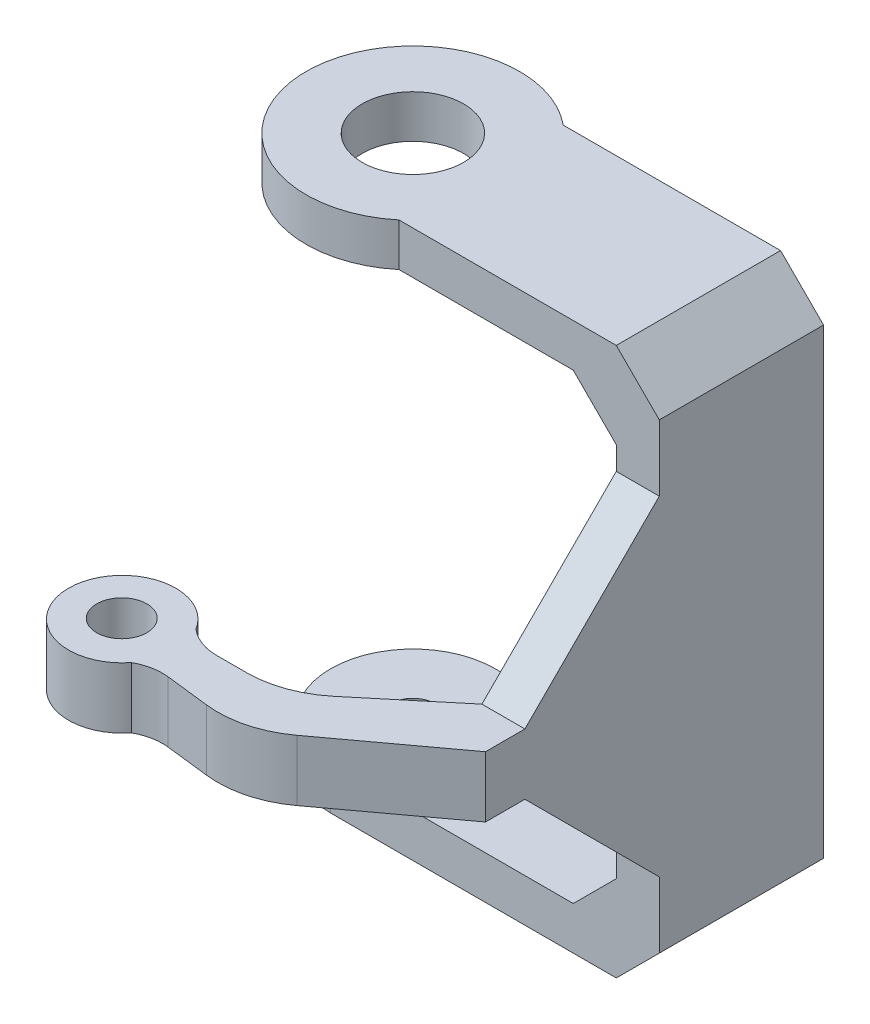
ISO-10303-21;
HEADER;
FILE_DESCRIPTION(('STEP AP214'),'2;1');
FILE_NAME('part.step','',(''),(''),'','','');
FILE_SCHEMA(('AUTOMOTIVE_DESIGN { 1 0 10303 214 1 1 1 1 }'));
ENDSEC;
DATA;
#1=APPLICATION_CONTEXT('core data for automotive mechanical design processes');
#2=APPLICATION_PROTOCOL_DEFINITION('international standard','automotive_design',2000,#1);
#3=PRODUCT_CONTEXT('',#1,'mechanical');
#4=PRODUCT('Part','Part','',(#3));
#5=PRODUCT_RELATED_PRODUCT_CATEGORY('part','',(#4));
#6=PRODUCT_DEFINITION_FORMATION('','',#4);
#7=PRODUCT_DEFINITION_CONTEXT('part definition',#1,'design');
#8=PRODUCT_DEFINITION('design','',#6,#7);
#9=PRODUCT_DEFINITION_SHAPE('','',#8);
#10=(LENGTH_UNIT() NAMED_UNIT(*) SI_UNIT(.MILLI.,.METRE.));
#11=(NAMED_UNIT(*) PLANE_ANGLE_UNIT() SI_UNIT($,.RADIAN.));
#12=(NAMED_UNIT(*) SI_UNIT($,.STERADIAN.) SOLID_ANGLE_UNIT());
#13=UNCERTAINTY_MEASURE_WITH_UNIT(LENGTH_MEASURE(1.E-05),#10,'distance_accuracy_value','');
#14=(GEOMETRIC_REPRESENTATION_CONTEXT(3) GLOBAL_UNCERTAINTY_ASSIGNED_CONTEXT((#13)) GLOBAL_UNIT_ASSIGNED_CONTEXT((#10,
#11,#12)) REPRESENTATION_CONTEXT('',''));
#15=CARTESIAN_POINT('',(0.,0.,0.));
#16=DIRECTION('',(0.,0.,1.));
#17=DIRECTION('',(1.,0.,0.));
#18=AXIS2_PLACEMENT_3D('',#15,#16,#17);
#19=CARTESIAN_POINT('',(0.,0.,5.73));
#20=DIRECTION('',(0.,0.,-1.));
#21=DIRECTION('',(-1.,0.,0.));
#22=AXIS2_PLACEMENT_3D('',#19,#20,#21);
#23=PLANE('',#22);
#24=DIRECTION('',(0.,-1.,0.));
#25=VECTOR('',#24,1.);
#26=CARTESIAN_POINT('',(35.166137814186,7.57800769576588,5.73));
#27=LINE('',#26,#25);
#28=CARTESIAN_POINT('',(35.166137814186,33.7980089760736,5.73));
#29=VERTEX_POINT('',#28);
#30=CARTESIAN_POINT('',(35.166137814186,32.188009467812,5.73));
#31=VERTEX_POINT('',#30);
#32=EDGE_CURVE('E465',#29,#31,#27,.T.);
#33=ORIENTED_EDGE('',*,*,#32,.T.);
#34=DIRECTION('',(1.,0.,0.));
#35=VECTOR('',#34,1.);
#36=CARTESIAN_POINT('',(35.166137814186,32.188009467812,5.73));
#37=LINE('',#36,#35);
#38=CARTESIAN_POINT('',(38.1661392372471,32.188009467812,5.73));
#39=VERTEX_POINT('',#38);
#40=EDGE_CURVE('E306',#31,#39,#37,.T.);
#41=ORIENTED_EDGE('',*,*,#40,.T.);
#42=DIRECTION('',(0.,1.,0.));
#43=VECTOR('',#42,1.);
#44=CARTESIAN_POINT('',(38.1661392372471,36.7980048111987,5.73));
#45=LINE('',#44,#43);
#46=CARTESIAN_POINT('',(38.1661392372471,36.7980048111987,5.73));
#47=VERTEX_POINT('',#46);
#48=EDGE_CURVE('E431',#39,#47,#45,.T.);
#49=ORIENTED_EDGE('',*,*,#48,.T.);
#50=DIRECTION('',(-0.707106561671647,0.70710700070138,0.));
#51=VECTOR('',#50,1.);
#52=CARTESIAN_POINT('',(35.1661387455087,39.7980071655833,5.73));
#53=LINE('',#52,#51);
#54=CARTESIAN_POINT('',(35.1658008859548,39.7976693062391,5.73));
#55=VERTEX_POINT('',#54);
#56=EDGE_CURVE('E422',#47,#55,#53,.T.);
#57=ORIENTED_EDGE('',*,*,#56,.T.);
#58=DIRECTION('',(-1.,0.,0.));
#59=VECTOR('',#58,1.);
#60=CARTESIAN_POINT('',(32.1661391850928,39.7973314468949,5.73));
#61=LINE('',#60,#59);
#62=CARTESIAN_POINT('',(20.0061391850928,39.7973314468949,5.73));
#63=VERTEX_POINT('',#62);
#64=EDGE_CURVE('E349',#55,#63,#61,.T.);
#65=ORIENTED_EDGE('',*,*,#64,.T.);
#66=DIRECTION('',(0.,-1.,0.));
#67=VECTOR('',#66,1.);
#68=CARTESIAN_POINT('',(20.0061391850928,39.7973314468949,5.73));
#69=LINE('',#68,#67);
#70=CARTESIAN_POINT('',(20.0061391850928,36.798009467812,5.73));
#71=VERTEX_POINT('',#70);
#72=EDGE_CURVE('E360',#63,#71,#69,.T.);
#73=ORIENTED_EDGE('',*,*,#72,.T.);
#74=DIRECTION('',(1.,0.,0.));
#75=VECTOR('',#74,1.);
#76=CARTESIAN_POINT('',(32.1661391850928,36.798009467812,5.73));
#77=LINE('',#76,#75);
#78=CARTESIAN_POINT('',(32.1661391850928,36.798009467812,5.73));
#79=VERTEX_POINT('',#78);
#80=EDGE_CURVE('E363',#71,#79,#77,.T.);
#81=ORIENTED_EDGE('',*,*,#80,.T.);
#82=DIRECTION('',(0.707106561671647,-0.70710700070138,0.));
#83=VECTOR('',#82,1.);
#84=CARTESIAN_POINT('',(35.166137814186,33.7980089760736,5.73));
#85=LINE('',#84,#83);
#86=EDGE_CURVE('E359',#79,#29,#85,.T.);
#87=ORIENTED_EDGE('',*,*,#86,.T.);
#88=EDGE_LOOP('',(#33,#41,#49,#57,#65,#73,#81,#87));
#89=FACE_BOUND('',#88,.T.);
#90=ADVANCED_FACE('F33',(#89),#23,.F.);
#91=CARTESIAN_POINT('',(35.166137814186,33.7980089760736,-5.73));
#92=DIRECTION('',(-0.70710700070138,-0.707106561671647,0.));
#93=DIRECTION('',(0.707106561671647,-0.70710700070138,0.));
#94=AXIS2_PLACEMENT_3D('',#91,#92,#93);
#95=PLANE('',#94);
#96=DIRECTION('',(0.,0.,1.));
#97=VECTOR('',#96,1.);
#98=CARTESIAN_POINT('',(35.166137814186,33.7980089760736,-5.73));
#99=LINE('',#98,#97);
#100=CARTESIAN_POINT('',(35.166137814186,33.7980089760736,-5.73));
#101=VERTEX_POINT('',#100);
#102=EDGE_CURVE('E419',#101,#29,#99,.T.);
#103=ORIENTED_EDGE('',*,*,#102,.T.);
#104=ORIENTED_EDGE('',*,*,#86,.F.);
#105=DIRECTION('',(0.,0.,1.));
#106=VECTOR('',#105,1.);
#107=CARTESIAN_POINT('',(32.1661391850928,36.798009467812,-5.73));
#108=LINE('',#107,#106);
#109=CARTESIAN_POINT('',(32.1661391850928,36.798009467812,-5.73));
#110=VERTEX_POINT('',#109);
#111=EDGE_CURVE('E11',#110,#79,#108,.T.);
#112=ORIENTED_EDGE('',*,*,#111,.F.);
#113=DIRECTION('',(0.707106561671647,-0.70710700070138,0.));
#114=VECTOR('',#113,1.);
#115=CARTESIAN_POINT('',(35.166137814186,33.7980089760736,-5.73));
#116=LINE('',#115,#114);
#117=EDGE_CURVE('E424',#110,#101,#116,.T.);
#118=ORIENTED_EDGE('',*,*,#117,.T.);
#119=EDGE_LOOP('',(#103,#104,#112,#118));
#120=FACE_BOUND('',#119,.T.);
#121=ADVANCED_FACE('F35',(#120),#95,.T.);
#122=CARTESIAN_POINT('',(35.1661387455087,39.7980071655833,-5.73));
#123=DIRECTION('',(0.70710700070138,0.707106561671647,0.));
#124=DIRECTION('',(-0.707106561671647,0.70710700070138,0.));
#125=AXIS2_PLACEMENT_3D('',#122,#123,#124);
#126=PLANE('',#125);
#127=CARTESIAN_POINT('',(35.1661387455087,39.7980071655833,-5.73));
#128=DIRECTION('',(0.,0.,1.));
#129=VECTOR('',#128,1.);
#130=LINE('',#127,#129);
#131=CARTESIAN_POINT('',(35.1658008859548,39.7976693062391,-5.73));
#132=VERTEX_POINT('',#131);
#133=EDGE_CURVE('E42',#132,#55,#130,.T.);
#134=ORIENTED_EDGE('',*,*,#133,.T.);
#135=ORIENTED_EDGE('',*,*,#56,.F.);
#136=DIRECTION('',(0.,0.,1.));
#137=VECTOR('',#136,1.);
#138=CARTESIAN_POINT('',(38.1661392372471,36.7980048111987,-5.73));
#139=LINE('',#138,#137);
#140=CARTESIAN_POINT('',(38.1661392372471,36.7980048111987,-5.73));
#141=VERTEX_POINT('',#140);
#142=EDGE_CURVE('E446',#141,#47,#139,.T.);
#143=ORIENTED_EDGE('',*,*,#142,.F.);
#144=DIRECTION('',(-0.707106561671647,0.70710700070138,0.));
#145=VECTOR('',#144,1.);
#146=CARTESIAN_POINT('',(35.1661387455087,39.7980071655833,-5.73));
#147=LINE('',#146,#145);
#148=EDGE_CURVE('E412',#141,#132,#147,.T.);
#149=ORIENTED_EDGE('',*,*,#148,.T.);
#150=EDGE_LOOP('',(#134,#135,#143,#149));
#151=FACE_BOUND('',#150,.T.);
#152=ADVANCED_FACE('F399',(#151),#126,.T.);
#153=CARTESIAN_POINT('',(38.1661392372471,36.7980048111987,-5.73));
#154=DIRECTION('',(1.,0.,0.));
#155=DIRECTION('',(0.,1.,0.));
#156=AXIS2_PLACEMENT_3D('',#153,#154,#155);
#157=PLANE('',#156);
#158=ORIENTED_EDGE('',*,*,#142,.T.);
#159=ORIENTED_EDGE('',*,*,#48,.F.);
#160=DIRECTION('',(0.,-0.707106781186546,0.707106781186549));
#161=VECTOR('',#160,1.);
#162=CARTESIAN_POINT('',(38.1661392372471,32.188009467812,5.73));
#163=LINE('',#162,#161);
#164=CARTESIAN_POINT('',(38.1661392372471,22.8117735492783,15.1062359185336));
#165=VERTEX_POINT('',#164);
#166=EDGE_CURVE('E276',#39,#165,#163,.T.);
#167=ORIENTED_EDGE('',*,*,#166,.T.);
#168=DIRECTION('',(0.,0.,1.));
#169=VECTOR('',#168,1.);
#170=CARTESIAN_POINT('',(38.1661392372471,22.8117747122887,15.1062359185336));
#171=LINE('',#170,#169);
#172=CARTESIAN_POINT('',(38.1661392372471,22.8117747122887,17.8562359185336));
#173=VERTEX_POINT('',#172);
#174=EDGE_CURVE('E243',#165,#173,#171,.T.);
#175=ORIENTED_EDGE('',*,*,#174,.T.);
#176=DIRECTION('',(0.,-1.,0.));
#177=VECTOR('',#176,1.);
#178=CARTESIAN_POINT('',(38.1661392372471,22.8117747122887,17.8562359185336));
#179=LINE('',#178,#177);
#180=CARTESIAN_POINT('',(38.1661392372471,18.5642447122887,17.8562359185336));
#181=VERTEX_POINT('',#180);
#182=EDGE_CURVE('E281',#173,#181,#179,.T.);
#183=ORIENTED_EDGE('',*,*,#182,.T.);
#184=DIRECTION('',(0.,0.,1.));
#185=VECTOR('',#184,1.);
#186=CARTESIAN_POINT('',(38.1661392372471,18.5642447122887,15.1062359185336));
#187=LINE('',#186,#185);
#188=CARTESIAN_POINT('',(38.1661392372471,18.5642447122887,15.1062359185336));
#189=VERTEX_POINT('',#188);
#190=EDGE_CURVE('E267',#189,#181,#187,.T.);
#191=ORIENTED_EDGE('',*,*,#190,.F.);
#192=DIRECTION('',(0.,-0.707106781186551,-0.707106781186544));
#193=VECTOR('',#192,1.);
#194=CARTESIAN_POINT('',(38.1661392372471,9.18800627270455,5.73));
#195=LINE('',#194,#193);
#196=CARTESIAN_POINT('',(38.1661392372471,9.18800627270455,5.73));
#197=VERTEX_POINT('',#196);
#198=EDGE_CURVE('E295',#189,#197,#195,.T.);
#199=ORIENTED_EDGE('',*,*,#198,.T.);
#200=CARTESIAN_POINT('',(38.1661392372471,4.57800627270455,5.73));
#201=VERTEX_POINT('',#200);
#202=EDGE_CURVE('E50',#201,#197,#45,.T.);
#203=ORIENTED_EDGE('',*,*,#202,.F.);
#204=DIRECTION('',(0.,0.,1.));
#205=VECTOR('',#204,1.);
#206=CARTESIAN_POINT('',(38.1661392372471,4.57800627270455,-5.73));
#207=LINE('',#206,#205);
#208=CARTESIAN_POINT('',(38.1661392372471,4.57800627270455,-5.73));
#209=VERTEX_POINT('',#208);
#210=EDGE_CURVE('E449',#209,#201,#207,.T.);
#211=ORIENTED_EDGE('',*,*,#210,.F.);
#212=DIRECTION('',(0.,1.,0.));
#213=VECTOR('',#212,1.);
#214=CARTESIAN_POINT('',(38.1661392372471,36.7980048111987,-5.73));
#215=LINE('',#214,#213);
#216=EDGE_CURVE('E420',#209,#141,#215,.T.);
#217=ORIENTED_EDGE('',*,*,#216,.T.);
#218=EDGE_LOOP('',(#158,#159,#167,#175,#183,#191,#199,#203,#211,#217));
#219=FACE_BOUND('',#218,.T.);
#220=ADVANCED_FACE('F403',(#219),#157,.T.);
#221=CARTESIAN_POINT('',(38.1661392372471,4.57800627270455,-5.73));
#222=DIRECTION('',(0.707106561671647,-0.70710700070138,0.));
#223=DIRECTION('',(0.70710700070138,0.707106561671647,0.));
#224=AXIS2_PLACEMENT_3D('',#221,#222,#223);
#225=PLANE('',#224);
#226=ORIENTED_EDGE('',*,*,#210,.T.);
#227=DIRECTION('',(0.70710700070138,0.707106561671647,0.));
#228=VECTOR('',#227,1.);
#229=CARTESIAN_POINT('',(38.1661392372471,4.57800627270455,5.73));
#230=LINE('',#229,#228);
#231=CARTESIAN_POINT('',(35.1661378141855,1.57800671228865,5.73));
#232=VERTEX_POINT('',#231);
#233=EDGE_CURVE('E433',#232,#201,#230,.T.);
#234=ORIENTED_EDGE('',*,*,#233,.F.);
#235=DIRECTION('',(0.,0.,1.));
#236=VECTOR('',#235,1.);
#237=CARTESIAN_POINT('',(35.1661378141855,1.57800671228865,-5.73));
#238=LINE('',#237,#236);
#239=CARTESIAN_POINT('',(35.1661378141855,1.57800671228865,-5.73));
#240=VERTEX_POINT('',#239);
#241=EDGE_CURVE('E451',#240,#232,#238,.T.);
#242=ORIENTED_EDGE('',*,*,#241,.F.);
#243=DIRECTION('',(0.70710700070138,0.707106561671647,0.));
#244=VECTOR('',#243,1.);
#245=CARTESIAN_POINT('',(38.1661392372471,4.57800627270455,-5.73));
#246=LINE('',#245,#244);
#247=EDGE_CURVE('E441',#240,#209,#246,.T.);
#248=ORIENTED_EDGE('',*,*,#247,.T.);
#249=EDGE_LOOP('',(#226,#234,#242,#248));
#250=FACE_BOUND('',#249,.T.);
#251=ADVANCED_FACE('F530',(#250),#225,.T.);
#252=CARTESIAN_POINT('',(32.1661373224477,4.5780090666727,-5.73));
#253=DIRECTION('',(-0.707106561671646,0.707107000701381,0.));
#254=DIRECTION('',(-0.707107000701381,-0.707106561671646,0.));
#255=AXIS2_PLACEMENT_3D('',#252,#253,#254);
#256=PLANE('',#255);
#257=DIRECTION('',(0.,0.,1.));
#258=VECTOR('',#257,1.);
#259=CARTESIAN_POINT('',(32.1661373224477,4.5780090666727,-5.73));
#260=LINE('',#259,#258);
#261=CARTESIAN_POINT('',(32.1661373224477,4.5780090666727,-5.73));
#262=VERTEX_POINT('',#261);
#263=CARTESIAN_POINT('',(32.1661373224477,4.5780090666727,5.73));
#264=VERTEX_POINT('',#263);
#265=EDGE_CURVE('E454',#262,#264,#260,.T.);
#266=ORIENTED_EDGE('',*,*,#265,.T.);
#267=DIRECTION('',(-0.707107000701381,-0.707106561671646,0.));
#268=VECTOR('',#267,1.);
#269=CARTESIAN_POINT('',(32.1661373224477,4.5780090666727,5.73));
#270=LINE('',#269,#268);
#271=CARTESIAN_POINT('',(35.166137814186,7.57800769576588,5.73));
#272=VERTEX_POINT('',#271);
#273=EDGE_CURVE('E467',#272,#264,#270,.T.);
#274=ORIENTED_EDGE('',*,*,#273,.F.);
#275=DIRECTION('',(0.,0.,1.));
#276=VECTOR('',#275,1.);
#277=CARTESIAN_POINT('',(35.166137814186,7.57800769576588,-5.73));
#278=LINE('',#277,#276);
#279=CARTESIAN_POINT('',(35.166137814186,7.57800769576588,-5.73));
#280=VERTEX_POINT('',#279);
#281=EDGE_CURVE('E456',#280,#272,#278,.T.);
#282=ORIENTED_EDGE('',*,*,#281,.F.);
#283=DIRECTION('',(-0.707107000701381,-0.707106561671646,0.));
#284=VECTOR('',#283,1.);
#285=CARTESIAN_POINT('',(32.1661373224477,4.5780090666727,-5.73));
#286=LINE('',#285,#284);
#287=EDGE_CURVE('E439',#280,#262,#286,.T.);
#288=ORIENTED_EDGE('',*,*,#287,.T.);
#289=EDGE_LOOP('',(#266,#274,#282,#288));
#290=FACE_BOUND('',#289,.T.);
#291=ADVANCED_FACE('F519',(#290),#256,.T.);
#292=CARTESIAN_POINT('',(35.166137814186,7.57800769576588,-5.73));
#293=DIRECTION('',(-1.,0.,0.));
#294=DIRECTION('',(0.,0.,1.));
#295=AXIS2_PLACEMENT_3D('',#292,#293,#294);
#296=PLANE('',#295);
#297=ORIENTED_EDGE('',*,*,#281,.T.);
#298=CARTESIAN_POINT('',(35.166137814186,9.18800627270455,5.73));
#299=VERTEX_POINT('',#298);
#300=EDGE_CURVE('E468',#299,#272,#27,.T.);
#301=ORIENTED_EDGE('',*,*,#300,.F.);
#302=DIRECTION('',(0.,-0.707106781186551,-0.707106781186544));
#303=VECTOR('',#302,1.);
#304=CARTESIAN_POINT('',(35.166137814186,9.18800627270455,5.73));
#305=LINE('',#304,#303);
#306=CARTESIAN_POINT('',(35.166137814186,18.5642421912382,15.1062359185336));
#307=VERTEX_POINT('',#306);
#308=EDGE_CURVE('E298',#307,#299,#305,.T.);
#309=ORIENTED_EDGE('',*,*,#308,.F.);
#310=DIRECTION('',(0.,-1.,0.));
#311=VECTOR('',#310,1.);
#312=CARTESIAN_POINT('',(35.166137814186,22.8117735492783,15.1062359185336));
#313=LINE('',#312,#311);
#314=CARTESIAN_POINT('',(35.166137814186,22.8117735492783,15.1062359185336));
#315=VERTEX_POINT('',#314);
#316=EDGE_CURVE('E294',#315,#307,#313,.T.);
#317=ORIENTED_EDGE('',*,*,#316,.F.);
#318=DIRECTION('',(0.,-0.707106781186546,0.707106781186549));
#319=VECTOR('',#318,1.);
#320=CARTESIAN_POINT('',(35.166137814186,32.188009467812,5.73));
#321=LINE('',#320,#319);
#322=EDGE_CURVE('E291',#31,#315,#321,.T.);
#323=ORIENTED_EDGE('',*,*,#322,.F.);
#324=ORIENTED_EDGE('',*,*,#32,.F.);
#325=ORIENTED_EDGE('',*,*,#102,.F.);
#326=DIRECTION('',(0.,-1.,0.));
#327=VECTOR('',#326,1.);
#328=CARTESIAN_POINT('',(35.166137814186,7.57800769576588,-5.73));
#329=LINE('',#328,#327);
#330=EDGE_CURVE('E429',#101,#280,#329,.T.);
#331=ORIENTED_EDGE('',*,*,#330,.T.);
#332=EDGE_LOOP('',(#297,#301,#309,#317,#323,#324,#325,#331));
#333=FACE_BOUND('',#332,.T.);
#334=ADVANCED_FACE('F397',(#333),#296,.T.);
#335=CARTESIAN_POINT('',(0.,0.,-5.73));
#336=DIRECTION('',(0.,0.,-1.));
#337=DIRECTION('',(-1.,0.,0.));
#338=AXIS2_PLACEMENT_3D('',#335,#336,#337);
#339=PLANE('',#338);
#340=ORIENTED_EDGE('',*,*,#117,.F.);
#341=DIRECTION('',(1.,0.,0.));
#342=VECTOR('',#341,1.);
#343=CARTESIAN_POINT('',(32.1661391850928,36.798009467812,-5.73));
#344=LINE('',#343,#342);
#345=CARTESIAN_POINT('',(20.0061391850928,36.798009467812,-5.73));
#346=VERTEX_POINT('',#345);
#347=EDGE_CURVE('E355',#346,#110,#344,.T.);
#348=ORIENTED_EDGE('',*,*,#347,.F.);
#349=DIRECTION('',(0.,-1.,0.));
#350=VECTOR('',#349,1.);
#351=CARTESIAN_POINT('',(20.0061391850928,39.7973314468949,-5.73));
#352=LINE('',#351,#350);
#353=CARTESIAN_POINT('',(20.0061391850928,39.7973314468949,-5.73));
#354=VERTEX_POINT('',#353);
#355=EDGE_CURVE('E353',#354,#346,#352,.T.);
#356=ORIENTED_EDGE('',*,*,#355,.F.);
#357=DIRECTION('',(-1.,0.,0.));
#358=VECTOR('',#357,1.);
#359=CARTESIAN_POINT('',(32.1661391850928,39.7973314468949,-5.73));
#360=LINE('',#359,#358);
#361=EDGE_CURVE('E356',#132,#354,#360,.T.);
#362=ORIENTED_EDGE('',*,*,#361,.F.);
#363=ORIENTED_EDGE('',*,*,#148,.F.);
#364=ORIENTED_EDGE('',*,*,#216,.F.);
#365=ORIENTED_EDGE('',*,*,#247,.F.);
#366=DIRECTION('',(1.,0.,0.));
#367=VECTOR('',#366,1.);
#368=CARTESIAN_POINT('',(20.0061373224477,1.57800671228865,-5.73));
#369=LINE('',#368,#367);
#370=CARTESIAN_POINT('',(15.2448788477451,1.57800671228865,-5.73));
#371=VERTEX_POINT('',#370);
#372=EDGE_CURVE('E345',#371,#240,#369,.T.);
#373=ORIENTED_EDGE('',*,*,#372,.F.);
#374=DIRECTION('',(0.,-1.,0.));
#375=VECTOR('',#374,1.);
#376=CARTESIAN_POINT('',(15.2448788477451,4.57800671228865,-5.73));
#377=LINE('',#376,#375);
#378=CARTESIAN_POINT('',(15.2448788477451,4.57800671228865,-5.73));
#379=VERTEX_POINT('',#378);
#380=EDGE_CURVE('E327',#379,#371,#377,.T.);
#381=ORIENTED_EDGE('',*,*,#380,.F.);
#382=DIRECTION('',(-1.,0.,0.));
#383=VECTOR('',#382,1.);
#384=CARTESIAN_POINT('',(32.1661373224477,4.5780090666727,-5.73));
#385=LINE('',#384,#383);
#386=EDGE_CURVE('E343',#262,#379,#385,.T.);
#387=ORIENTED_EDGE('',*,*,#386,.F.);
#388=ORIENTED_EDGE('',*,*,#287,.F.);
#389=ORIENTED_EDGE('',*,*,#330,.F.);
#390=EDGE_LOOP('',(#340,#348,#356,#362,#363,#364,#365,#373,#381,#387,#388,#389));
#391=FACE_BOUND('',#390,.T.);
#392=ADVANCED_FACE('F394',(#391),#339,.T.);
#393=ORIENTED_EDGE('',*,*,#202,.T.);
#394=DIRECTION('',(1.,0.,0.));
#395=VECTOR('',#394,1.);
#396=CARTESIAN_POINT('',(35.166137814186,9.18800627270455,5.73));
#397=LINE('',#396,#395);
#398=EDGE_CURVE('E54',#299,#197,#397,.T.);
#399=ORIENTED_EDGE('',*,*,#398,.F.);
#400=ORIENTED_EDGE('',*,*,#300,.T.);
#401=ORIENTED_EDGE('',*,*,#273,.T.);
#402=DIRECTION('',(-1.,0.,0.));
#403=VECTOR('',#402,1.);
#404=CARTESIAN_POINT('',(32.1661373224477,4.5780090666727,5.73));
#405=LINE('',#404,#403);
#406=CARTESIAN_POINT('',(15.2448788477451,4.57800671228865,5.73));
#407=VERTEX_POINT('',#406);
#408=EDGE_CURVE('E341',#264,#407,#405,.T.);
#409=ORIENTED_EDGE('',*,*,#408,.T.);
#410=DIRECTION('',(0.,-1.,0.));
#411=VECTOR('',#410,1.);
#412=CARTESIAN_POINT('',(15.2448788477451,4.57800671228865,5.73));
#413=LINE('',#412,#411);
#414=CARTESIAN_POINT('',(15.2448788477451,1.57800671228865,5.73));
#415=VERTEX_POINT('',#414);
#416=EDGE_CURVE('E324',#407,#415,#413,.T.);
#417=ORIENTED_EDGE('',*,*,#416,.T.);
#418=DIRECTION('',(1.,0.,0.));
#419=VECTOR('',#418,1.);
#420=CARTESIAN_POINT('',(35.1661378141855,1.57800671228865,5.73));
#421=LINE('',#420,#419);
#422=EDGE_CURVE('E346',#415,#232,#421,.T.);
#423=ORIENTED_EDGE('',*,*,#422,.T.);
#424=ORIENTED_EDGE('',*,*,#233,.T.);
#425=EDGE_LOOP('',(#393,#399,#400,#401,#409,#417,#423,#424));
#426=FACE_BOUND('',#425,.T.);
#427=ADVANCED_FACE('F391',(#426),#23,.F.);
#428=CARTESIAN_POINT('',(32.1661391850928,36.798009467812,-5.73));
#429=DIRECTION('',(0.,-1.,0.));
#430=DIRECTION('',(0.,0.,-1.));
#431=AXIS2_PLACEMENT_3D('',#428,#429,#430);
#432=PLANE('',#431);
#433=CARTESIAN_POINT('',(15.2448788477452,36.798009467812,0.));
#434=DIRECTION('',(0.,1.,0.));
#435=DIRECTION('',(0.,0.,1.));
#436=AXIS2_PLACEMENT_3D('',#433,#434,#435);
#437=CIRCLE('',#436,3.54);
#438=CARTESIAN_POINT('',(15.2448788477452,36.798009467812,3.54));
#439=VERTEX_POINT('',#438);
#440=EDGE_CURVE('E333',#439,#439,#437,.T.);
#441=ORIENTED_EDGE('',*,*,#440,.T.);
#442=EDGE_LOOP('',(#441));
#443=FACE_BOUND('',#442,.T.);
#444=ORIENTED_EDGE('',*,*,#80,.F.);
#445=CARTESIAN_POINT('',(15.2448788477452,36.798009467812,0.));
#446=DIRECTION('',(0.,1.,0.));
#447=DIRECTION('',(0.,0.,1.));
#448=AXIS2_PLACEMENT_3D('',#445,#446,#447);
#449=CIRCLE('',#448,7.45);
#450=EDGE_CURVE('E339',#346,#71,#449,.T.);
#451=ORIENTED_EDGE('',*,*,#450,.F.);
#452=ORIENTED_EDGE('',*,*,#347,.T.);
#453=ORIENTED_EDGE('',*,*,#111,.T.);
#454=EDGE_LOOP('',(#444,#451,#452,#453));
#455=FACE_BOUND('',#454,.T.);
#456=ADVANCED_FACE('F388',(#443,#455),#432,.T.);
#457=CARTESIAN_POINT('',(32.1661391850928,39.7973314468949,-5.73));
#458=DIRECTION('',(0.,1.,0.));
#459=DIRECTION('',(0.,0.,1.));
#460=AXIS2_PLACEMENT_3D('',#457,#458,#459);
#461=PLANE('',#460);
#462=CARTESIAN_POINT('',(15.2448788477452,39.7973314468949,0.));
#463=DIRECTION('',(0.,1.,0.));
#464=DIRECTION('',(0.,0.,1.));
#465=AXIS2_PLACEMENT_3D('',#462,#463,#464);
#466=CIRCLE('',#465,3.54);
#467=CARTESIAN_POINT('',(15.2448788477452,39.7973314468949,3.54));
#468=VERTEX_POINT('',#467);
#469=EDGE_CURVE('E330',#468,#468,#466,.T.);
#470=ORIENTED_EDGE('',*,*,#469,.F.);
#471=EDGE_LOOP('',(#470));
#472=FACE_BOUND('',#471,.T.);
#473=ORIENTED_EDGE('',*,*,#64,.F.);
#474=ORIENTED_EDGE('',*,*,#133,.F.);
#475=ORIENTED_EDGE('',*,*,#361,.T.);
#476=CARTESIAN_POINT('',(15.2448788477452,39.7973314468949,0.));
#477=DIRECTION('',(0.,1.,0.));
#478=DIRECTION('',(0.,0.,1.));
#479=AXIS2_PLACEMENT_3D('',#476,#477,#478);
#480=CIRCLE('',#479,7.45);
#481=EDGE_CURVE('E336',#354,#63,#480,.T.);
#482=ORIENTED_EDGE('',*,*,#481,.T.);
#483=EDGE_LOOP('',(#473,#474,#475,#482));
#484=FACE_BOUND('',#483,.T.);
#485=ADVANCED_FACE('F377',(#472,#484),#461,.T.);
#486=CARTESIAN_POINT('',(32.1661373224477,4.5780090666727,-5.73));
#487=DIRECTION('',(0.,1.,0.));
#488=DIRECTION('',(-1.,0.,0.));
#489=AXIS2_PLACEMENT_3D('',#486,#487,#488);
#490=PLANE('',#489);
#491=CARTESIAN_POINT('',(15.2448788477451,4.57800671228865,0.));
#492=DIRECTION('',(0.,-1.,0.));
#493=DIRECTION('',(0.,0.,-1.));
#494=AXIS2_PLACEMENT_3D('',#491,#492,#493);
#495=CIRCLE('',#494,1.52);
#496=CARTESIAN_POINT('',(15.2448788477451,4.57800671228865,-1.52));
#497=VERTEX_POINT('',#496);
#498=EDGE_CURVE('E315',#497,#497,#495,.T.);
#499=ORIENTED_EDGE('',*,*,#498,.T.);
#500=EDGE_LOOP('',(#499));
#501=FACE_BOUND('',#500,.T.);
#502=ORIENTED_EDGE('',*,*,#408,.F.);
#503=ORIENTED_EDGE('',*,*,#265,.F.);
#504=ORIENTED_EDGE('',*,*,#386,.T.);
#505=CARTESIAN_POINT('',(15.2448788477451,4.57800671228865,0.));
#506=DIRECTION('',(0.,-1.,0.));
#507=DIRECTION('',(0.,0.,-1.));
#508=AXIS2_PLACEMENT_3D('',#505,#506,#507);
#509=CIRCLE('',#508,5.73);
#510=EDGE_CURVE('E321',#407,#379,#509,.T.);
#511=ORIENTED_EDGE('',*,*,#510,.F.);
#512=EDGE_LOOP('',(#502,#503,#504,#511));
#513=FACE_BOUND('',#512,.T.);
#514=ADVANCED_FACE('F387',(#501,#513),#490,.T.);
#515=CARTESIAN_POINT('',(35.1661378141855,1.57800671228865,-5.73));
#516=DIRECTION('',(0.,-1.,0.));
#517=DIRECTION('',(0.,0.,-1.));
#518=AXIS2_PLACEMENT_3D('',#515,#516,#517);
#519=PLANE('',#518);
#520=CARTESIAN_POINT('',(15.2448788477451,1.57800671228865,0.));
#521=DIRECTION('',(0.,-1.,0.));
#522=DIRECTION('',(0.,0.,-1.));
#523=AXIS2_PLACEMENT_3D('',#520,#521,#522);
#524=CIRCLE('',#523,1.52);
#525=CARTESIAN_POINT('',(15.2448788477451,1.57800671228865,-1.52));
#526=VERTEX_POINT('',#525);
#527=EDGE_CURVE('E309',#526,#526,#524,.T.);
#528=ORIENTED_EDGE('',*,*,#527,.F.);
#529=EDGE_LOOP('',(#528));
#530=FACE_BOUND('',#529,.T.);
#531=ORIENTED_EDGE('',*,*,#422,.F.);
#532=CARTESIAN_POINT('',(15.2448788477451,1.57800671228865,0.));
#533=DIRECTION('',(0.,-1.,0.));
#534=DIRECTION('',(0.,0.,-1.));
#535=AXIS2_PLACEMENT_3D('',#532,#533,#534);
#536=CIRCLE('',#535,5.73);
#537=EDGE_CURVE('E318',#415,#371,#536,.T.);
#538=ORIENTED_EDGE('',*,*,#537,.T.);
#539=ORIENTED_EDGE('',*,*,#372,.T.);
#540=ORIENTED_EDGE('',*,*,#241,.T.);
#541=EDGE_LOOP('',(#531,#538,#539,#540));
#542=FACE_BOUND('',#541,.T.);
#543=ADVANCED_FACE('F529',(#530,#542),#519,.T.);
#544=CARTESIAN_POINT('',(15.2448788477452,36.798009467812,0.));
#545=DIRECTION('',(0.,1.,0.));
#546=DIRECTION('',(0.,0.,1.));
#547=AXIS2_PLACEMENT_3D('',#544,#545,#546);
#548=CYLINDRICAL_SURFACE('',#547,7.45);
#549=ORIENTED_EDGE('',*,*,#481,.F.);
#550=ORIENTED_EDGE('',*,*,#355,.T.);
#551=ORIENTED_EDGE('',*,*,#450,.T.);
#552=ORIENTED_EDGE('',*,*,#72,.F.);
#553=EDGE_LOOP('',(#549,#550,#551,#552));
#554=FACE_BOUND('',#553,.T.);
#555=ADVANCED_FACE('F512',(#554),#548,.T.);
#556=CARTESIAN_POINT('',(15.2448788477452,36.798009467812,0.));
#557=DIRECTION('',(0.,1.,0.));
#558=DIRECTION('',(0.,0.,1.));
#559=AXIS2_PLACEMENT_3D('',#556,#557,#558);
#560=CYLINDRICAL_SURFACE('',#559,3.54);
#561=ORIENTED_EDGE('',*,*,#440,.F.);
#562=EDGE_LOOP('',(#561));
#563=FACE_BOUND('',#562,.T.);
#564=ORIENTED_EDGE('',*,*,#469,.T.);
#565=EDGE_LOOP('',(#564));
#566=FACE_BOUND('',#565,.T.);
#567=ADVANCED_FACE('F569',(#563,#566),#560,.F.);
#568=CARTESIAN_POINT('',(15.2448788477451,4.57800671228865,0.));
#569=DIRECTION('',(0.,-1.,0.));
#570=DIRECTION('',(0.,0.,-1.));
#571=AXIS2_PLACEMENT_3D('',#568,#569,#570);
#572=CYLINDRICAL_SURFACE('',#571,5.73);
#573=ORIENTED_EDGE('',*,*,#537,.F.);
#574=ORIENTED_EDGE('',*,*,#416,.F.);
#575=ORIENTED_EDGE('',*,*,#510,.T.);
#576=ORIENTED_EDGE('',*,*,#380,.T.);
#577=EDGE_LOOP('',(#573,#574,#575,#576));
#578=FACE_BOUND('',#577,.T.);
#579=ADVANCED_FACE('F527',(#578),#572,.T.);
#580=CARTESIAN_POINT('',(15.2448788477451,4.57800671228865,0.));
#581=DIRECTION('',(0.,-1.,0.));
#582=DIRECTION('',(0.,0.,-1.));
#583=AXIS2_PLACEMENT_3D('',#580,#581,#582);
#584=CYLINDRICAL_SURFACE('',#583,1.52);
#585=ORIENTED_EDGE('',*,*,#498,.F.);
#586=EDGE_LOOP('',(#585));
#587=FACE_BOUND('',#586,.T.);
#588=ORIENTED_EDGE('',*,*,#527,.T.);
#589=EDGE_LOOP('',(#588));
#590=FACE_BOUND('',#589,.T.);
#591=ADVANCED_FACE('F615',(#587,#590),#584,.F.);
#592=CARTESIAN_POINT('',(35.166137814186,32.188009467812,5.73));
#593=DIRECTION('',(0.,0.707106781186549,0.707106781186546));
#594=DIRECTION('',(0.,-0.707106781186546,0.707106781186549));
#595=AXIS2_PLACEMENT_3D('',#592,#593,#594);
#596=PLANE('',#595);
#597=ORIENTED_EDGE('',*,*,#166,.F.);
#598=ORIENTED_EDGE('',*,*,#40,.F.);
#599=ORIENTED_EDGE('',*,*,#322,.T.);
#600=DIRECTION('',(1.,0.,0.));
#601=VECTOR('',#600,1.);
#602=CARTESIAN_POINT('',(35.166137814186,22.8117735492783,15.1062359185336));
#603=LINE('',#602,#601);
#604=EDGE_CURVE('E301',#315,#165,#603,.T.);
#605=ORIENTED_EDGE('',*,*,#604,.T.);
#606=EDGE_LOOP('',(#597,#598,#599,#605));
#607=FACE_BOUND('',#606,.T.);
#608=ADVANCED_FACE('F506',(#607),#596,.T.);
#609=CARTESIAN_POINT('',(35.166137814186,9.18800627270455,5.73));
#610=DIRECTION('',(0.,-0.707106781186544,0.707106781186551));
#611=DIRECTION('',(0.,-0.707106781186551,-0.707106781186544));
#612=AXIS2_PLACEMENT_3D('',#609,#610,#611);
#613=PLANE('',#612);
#614=ORIENTED_EDGE('',*,*,#198,.F.);
#615=DIRECTION('',(1.,0.,0.));
#616=VECTOR('',#615,1.);
#617=CARTESIAN_POINT('',(35.166137814186,18.5642421912382,15.1062359185336));
#618=LINE('',#617,#616);
#619=EDGE_CURVE('E311',#307,#189,#618,.T.);
#620=ORIENTED_EDGE('',*,*,#619,.F.);
#621=ORIENTED_EDGE('',*,*,#308,.T.);
#622=ORIENTED_EDGE('',*,*,#398,.T.);
#623=EDGE_LOOP('',(#614,#620,#621,#622));
#624=FACE_BOUND('',#623,.T.);
#625=ADVANCED_FACE('F484',(#624),#613,.T.);
#626=CARTESIAN_POINT('',(22.1512821075954,22.8117747122887,27.9144170031307));
#627=DIRECTION('',(0.,-1.,0.));
#628=DIRECTION('',(0.,0.,-1.));
#629=AXIS2_PLACEMENT_3D('',#626,#627,#628);
#630=CYLINDRICAL_SURFACE('',#629,3.54);
#631=CARTESIAN_POINT('',(22.1512821075954,18.5642447122887,27.9144170031307));
#632=DIRECTION('',(0.,1.,0.));
#633=DIRECTION('',(0.,0.,1.));
#634=AXIS2_PLACEMENT_3D('',#631,#632,#633);
#635=CIRCLE('',#634,3.54);
#636=CARTESIAN_POINT('',(22.5655217673864,18.5642447122887,24.3987370540659));
#637=VERTEX_POINT('',#636);
#638=CARTESIAN_POINT('',(20.4234003758437,18.5642447122887,24.8247528270302));
#639=VERTEX_POINT('',#638);
#640=EDGE_CURVE('E252',#637,#639,#635,.T.);
#641=ORIENTED_EDGE('',*,*,#640,.F.);
#642=DIRECTION('',(0.,-1.,0.));
#643=VECTOR('',#642,1.);
#644=CARTESIAN_POINT('',(22.5655217673864,22.8117747122887,24.3987370540659));
#645=LINE('',#644,#643);
#646=CARTESIAN_POINT('',(22.5655217673864,22.8117747122887,24.3987370540659));
#647=VERTEX_POINT('',#646);
#648=EDGE_CURVE('E225',#647,#637,#645,.T.);
#649=ORIENTED_EDGE('',*,*,#648,.F.);
#650=CARTESIAN_POINT('',(22.1512821075954,22.8117747122887,27.9144170031307));
#651=DIRECTION('',(0.,1.,0.));
#652=DIRECTION('',(0.,0.,1.));
#653=AXIS2_PLACEMENT_3D('',#650,#651,#652);
#654=CIRCLE('',#653,3.54);
#655=CARTESIAN_POINT('',(20.4234003758437,22.8117747122887,24.8247528270302));
#656=VERTEX_POINT('',#655);
#657=EDGE_CURVE('E218',#647,#656,#654,.T.);
#658=ORIENTED_EDGE('',*,*,#657,.T.);
#659=DIRECTION('',(0.,-1.,0.));
#660=VECTOR('',#659,1.);
#661=CARTESIAN_POINT('',(20.4234003758437,22.8117747122887,24.8247528270302));
#662=LINE('',#661,#660);
#663=EDGE_CURVE('E201',#656,#639,#662,.T.);
#664=ORIENTED_EDGE('',*,*,#663,.T.);
#665=EDGE_LOOP('',(#641,#649,#658,#664));
#666=FACE_BOUND('',#665,.T.);
#667=ADVANCED_FACE('F224',(#666),#630,.F.);
#668=CARTESIAN_POINT('',(25.6207680447676,22.8117747122887,24.7587255049078));
#669=DIRECTION('',(-0.11701685304828,0.,0.993129929114352));
#670=DIRECTION('',(0.993129929114352,0.,0.11701685304828));
#671=AXIS2_PLACEMENT_3D('',#668,#669,#670);
#672=PLANE('',#671);
#673=DIRECTION('',(-0.993129929114352,0.,-0.11701685304828));
#674=VECTOR('',#673,1.);
#675=CARTESIAN_POINT('',(25.6207680447676,18.5642447122887,24.7587255049078));
#676=LINE('',#675,#674);
#677=CARTESIAN_POINT('',(25.6207680447676,18.5642447122887,24.7587255049078));
#678=VERTEX_POINT('',#677);
#679=EDGE_CURVE('E226',#678,#637,#676,.T.);
#680=ORIENTED_EDGE('',*,*,#679,.F.);
#681=DIRECTION('',(0.,-1.,0.));
#682=VECTOR('',#681,1.);
#683=CARTESIAN_POINT('',(25.6207680447676,22.8117747122887,24.7587255049078));
#684=LINE('',#683,#682);
#685=CARTESIAN_POINT('',(25.6207680447676,22.8117747122887,24.7587255049078));
#686=VERTEX_POINT('',#685);
#687=EDGE_CURVE('E277',#686,#678,#684,.T.);
#688=ORIENTED_EDGE('',*,*,#687,.F.);
#689=DIRECTION('',(-0.993129929114352,0.,-0.11701685304828));
#690=VECTOR('',#689,1.);
#691=CARTESIAN_POINT('',(25.6207680447676,22.8117747122887,24.7587255049078));
#692=LINE('',#691,#690);
#693=EDGE_CURVE('E212',#686,#647,#692,.T.);
#694=ORIENTED_EDGE('',*,*,#693,.T.);
#695=ORIENTED_EDGE('',*,*,#648,.T.);
#696=EDGE_LOOP('',(#680,#688,#694,#695));
#697=FACE_BOUND('',#696,.T.);
#698=ADVANCED_FACE('F681',(#697),#672,.T.);
#699=CARTESIAN_POINT('',(26.4398860161055,22.8117747122887,17.8068160011073));
#700=DIRECTION('',(0.,-1.,0.));
#701=DIRECTION('',(0.,0.,-1.));
#702=AXIS2_PLACEMENT_3D('',#699,#700,#701);
#703=CYLINDRICAL_SURFACE('',#702,7.);
#704=CARTESIAN_POINT('',(26.4398860161055,18.5642447122887,17.8068160011073));
#705=DIRECTION('',(0.,1.,0.));
#706=DIRECTION('',(0.,0.,1.));
#707=AXIS2_PLACEMENT_3D('',#704,#705,#706);
#708=CIRCLE('',#707,7.);
#709=CARTESIAN_POINT('',(30.594801522341,18.5642447122887,23.4403474988488));
#710=VERTEX_POINT('',#709);
#711=EDGE_CURVE('E229',#678,#710,#708,.T.);
#712=ORIENTED_EDGE('',*,*,#711,.T.);
#713=DIRECTION('',(0.,-1.,0.));
#714=VECTOR('',#713,1.);
#715=CARTESIAN_POINT('',(30.594801522341,22.8117747122887,23.4403474988488));
#716=LINE('',#715,#714);
#717=CARTESIAN_POINT('',(30.594801522341,22.8117747122887,23.4403474988488));
#718=VERTEX_POINT('',#717);
#719=EDGE_CURVE('E279',#718,#710,#716,.T.);
#720=ORIENTED_EDGE('',*,*,#719,.F.);
#721=CARTESIAN_POINT('',(26.4398860161055,22.8117747122887,17.8068160011073));
#722=DIRECTION('',(0.,1.,0.));
#723=DIRECTION('',(0.,0.,1.));
#724=AXIS2_PLACEMENT_3D('',#721,#722,#723);
#725=CIRCLE('',#724,7.);
#726=EDGE_CURVE('E249',#686,#718,#725,.T.);
#727=ORIENTED_EDGE('',*,*,#726,.F.);
#728=ORIENTED_EDGE('',*,*,#687,.T.);
#729=EDGE_LOOP('',(#712,#720,#727,#728));
#730=FACE_BOUND('',#729,.T.);
#731=ADVANCED_FACE('F688',(#730),#703,.T.);
#732=CARTESIAN_POINT('',(38.1661392372471,22.8117747122887,17.8562359185336));
#733=DIRECTION('',(0.593559358033627,0.,0.80479021396306));
#734=DIRECTION('',(0.80479021396306,0.,-0.593559358033627));
#735=AXIS2_PLACEMENT_3D('',#732,#733,#734);
#736=PLANE('',#735);
#737=DIRECTION('',(-0.80479021396306,0.,0.593559358033627));
#738=VECTOR('',#737,1.);
#739=CARTESIAN_POINT('',(38.1661392372471,18.5642447122887,17.8562359185336));
#740=LINE('',#739,#738);
#741=EDGE_CURVE('E270',#181,#710,#740,.T.);
#742=ORIENTED_EDGE('',*,*,#741,.F.);
#743=ORIENTED_EDGE('',*,*,#182,.F.);
#744=DIRECTION('',(-0.80479021396306,0.,0.593559358033627));
#745=VECTOR('',#744,1.);
#746=CARTESIAN_POINT('',(38.1661392372471,22.8117747122887,17.8562359185336));
#747=LINE('',#746,#745);
#748=EDGE_CURVE('E246',#173,#718,#747,.T.);
#749=ORIENTED_EDGE('',*,*,#748,.T.);
#750=ORIENTED_EDGE('',*,*,#719,.T.);
#751=EDGE_LOOP('',(#742,#743,#749,#750));
#752=FACE_BOUND('',#751,.T.);
#753=ADVANCED_FACE('F696',(#752),#736,.T.);
#754=CARTESIAN_POINT('',(35.166137814186,22.8117747122887,15.1062359185336));
#755=DIRECTION('',(0.639707339446219,0.,0.768618578918464));
#756=DIRECTION('',(0.768618578918464,0.,-0.639707339446219));
#757=AXIS2_PLACEMENT_3D('',#754,#755,#756);
#758=PLANE('',#757);
#759=DIRECTION('',(-0.768618578918464,0.,0.639707339446219));
#760=VECTOR('',#759,1.);
#761=CARTESIAN_POINT('',(35.166137814186,18.5642447122887,15.1062359185336));
#762=LINE('',#761,#760);
#763=CARTESIAN_POINT('',(29.5336179201273,18.5642447122887,19.7940803379025));
#764=VERTEX_POINT('',#763);
#765=EDGE_CURVE('E264',#307,#764,#762,.T.);
#766=ORIENTED_EDGE('',*,*,#765,.T.);
#767=DIRECTION('',(0.,-1.,0.));
#768=VECTOR('',#767,1.);
#769=CARTESIAN_POINT('',(29.5336179201273,22.8117747122887,19.7940803379025));
#770=LINE('',#769,#768);
#771=CARTESIAN_POINT('',(29.5336179201273,22.8117747122887,19.7940803379025));
#772=VERTEX_POINT('',#771);
#773=EDGE_CURVE('E283',#772,#764,#770,.T.);
#774=ORIENTED_EDGE('',*,*,#773,.F.);
#775=DIRECTION('',(-0.768618578918464,0.,0.639707339446219));
#776=VECTOR('',#775,1.);
#777=CARTESIAN_POINT('',(35.166137814186,22.8117747122887,15.1062359185336));
#778=LINE('',#777,#776);
#779=EDGE_CURVE('E241',#315,#772,#778,.T.);
#780=ORIENTED_EDGE('',*,*,#779,.F.);
#781=ORIENTED_EDGE('',*,*,#316,.T.);
#782=EDGE_LOOP('',(#766,#774,#780,#781));
#783=FACE_BOUND('',#782,.T.);
#784=ADVANCED_FACE('F489',(#783),#758,.F.);
#785=CARTESIAN_POINT('',(25.0556665440037,22.8117747122887,14.4137502854733));
#786=DIRECTION('',(0.,-1.,0.));
#787=DIRECTION('',(0.,0.,-1.));
#788=AXIS2_PLACEMENT_3D('',#785,#786,#787);
#789=CYLINDRICAL_SURFACE('',#788,7.);
#790=CARTESIAN_POINT('',(25.0556665440037,18.5642447122887,14.4137502854733));
#791=DIRECTION('',(0.,1.,0.));
#792=DIRECTION('',(0.,0.,1.));
#793=AXIS2_PLACEMENT_3D('',#790,#791,#792);
#794=CIRCLE('',#793,7.);
#795=CARTESIAN_POINT('',(25.0556665440037,18.5642447122887,21.4137502854733));
#796=VERTEX_POINT('',#795);
#797=EDGE_CURVE('E261',#796,#764,#794,.T.);
#798=ORIENTED_EDGE('',*,*,#797,.F.);
#799=DIRECTION('',(0.,-1.,0.));
#800=VECTOR('',#799,1.);
#801=CARTESIAN_POINT('',(25.0556665440037,22.8117747122887,21.4137502854733));
#802=LINE('',#801,#800);
#803=CARTESIAN_POINT('',(25.0556665440037,22.8117747122887,21.4137502854733));
#804=VERTEX_POINT('',#803);
#805=EDGE_CURVE('E285',#804,#796,#802,.T.);
#806=ORIENTED_EDGE('',*,*,#805,.F.);
#807=CARTESIAN_POINT('',(25.0556665440037,22.8117747122887,14.4137502854733));
#808=DIRECTION('',(0.,1.,0.));
#809=DIRECTION('',(0.,0.,1.));
#810=AXIS2_PLACEMENT_3D('',#807,#808,#809);
#811=CIRCLE('',#810,7.);
#812=EDGE_CURVE('E238',#804,#772,#811,.T.);
#813=ORIENTED_EDGE('',*,*,#812,.T.);
#814=ORIENTED_EDGE('',*,*,#773,.T.);
#815=EDGE_LOOP('',(#798,#806,#813,#814));
#816=FACE_BOUND('',#815,.T.);
#817=ADVANCED_FACE('F498',(#816),#789,.F.);
#818=CARTESIAN_POINT('',(25.0556665440037,22.8117747122887,21.4137502854733));
#819=DIRECTION('',(0.,0.,1.));
#820=DIRECTION('',(1.,0.,0.));
#821=AXIS2_PLACEMENT_3D('',#818,#819,#820);
#822=PLANE('',#821);
#823=DIRECTION('',(-1.,0.,0.));
#824=VECTOR('',#823,1.);
#825=CARTESIAN_POINT('',(25.0556665440037,18.5642447122887,21.4137502854733));
#826=LINE('',#825,#824);
#827=CARTESIAN_POINT('',(22.97755862605,18.5642447122887,21.4137502854733));
#828=VERTEX_POINT('',#827);
#829=EDGE_CURVE('E259',#796,#828,#826,.T.);
#830=ORIENTED_EDGE('',*,*,#829,.T.);
#831=DIRECTION('',(0.,-1.,0.));
#832=VECTOR('',#831,1.);
#833=CARTESIAN_POINT('',(22.97755862605,22.8117747122887,21.4137502854733));
#834=LINE('',#833,#832);
#835=CARTESIAN_POINT('',(22.97755862605,22.8117747122887,21.4137502854733));
#836=VERTEX_POINT('',#835);
#837=EDGE_CURVE('E287',#836,#828,#834,.T.);
#838=ORIENTED_EDGE('',*,*,#837,.F.);
#839=DIRECTION('',(-1.,0.,0.));
#840=VECTOR('',#839,1.);
#841=CARTESIAN_POINT('',(25.0556665440037,22.8117747122887,21.4137502854733));
#842=LINE('',#841,#840);
#843=EDGE_CURVE('E236',#804,#836,#842,.T.);
#844=ORIENTED_EDGE('',*,*,#843,.F.);
#845=ORIENTED_EDGE('',*,*,#805,.T.);
#846=EDGE_LOOP('',(#830,#838,#844,#845));
#847=FACE_BOUND('',#846,.T.);
#848=ADVANCED_FACE('F717',(#847),#822,.F.);
#849=CARTESIAN_POINT('',(22.97755862605,22.8117747122887,17.8737502854733));
#850=DIRECTION('',(0.,-1.,0.));
#851=DIRECTION('',(0.,0.,-1.));
#852=AXIS2_PLACEMENT_3D('',#849,#850,#851);
#853=CYLINDRICAL_SURFACE('',#852,3.54);
#854=CARTESIAN_POINT('',(22.97755862605,18.5642447122887,17.8737502854733));
#855=DIRECTION('',(0.,-1.,0.));
#856=DIRECTION('',(0.,0.,-1.));
#857=AXIS2_PLACEMENT_3D('',#854,#855,#856);
#858=CIRCLE('',#857,3.54);
#859=CARTESIAN_POINT('',(20.6683072103526,18.5642447122887,20.5568376674084));
#860=VERTEX_POINT('',#859);
#861=EDGE_CURVE('E256',#828,#860,#858,.T.);
#862=ORIENTED_EDGE('',*,*,#861,.T.);
#863=DIRECTION('',(0.,-1.,0.));
#864=VECTOR('',#863,1.);
#865=CARTESIAN_POINT('',(20.6683072103526,22.8117747122887,20.5568376674084));
#866=LINE('',#865,#864);
#867=CARTESIAN_POINT('',(20.6683072103526,22.8117747122887,20.5568376674084));
#868=VERTEX_POINT('',#867);
#869=EDGE_CURVE('E211',#868,#860,#866,.T.);
#870=ORIENTED_EDGE('',*,*,#869,.F.);
#871=CARTESIAN_POINT('',(22.97755862605,22.8117747122887,17.8737502854733));
#872=DIRECTION('',(0.,-1.,0.));
#873=DIRECTION('',(0.,0.,-1.));
#874=AXIS2_PLACEMENT_3D('',#871,#872,#873);
#875=CIRCLE('',#874,3.54);
#876=EDGE_CURVE('E221',#836,#868,#875,.T.);
#877=ORIENTED_EDGE('',*,*,#876,.F.);
#878=ORIENTED_EDGE('',*,*,#837,.T.);
#879=EDGE_LOOP('',(#862,#870,#877,#878));
#880=FACE_BOUND('',#879,.T.);
#881=ADVANCED_FACE('F724',(#880),#853,.F.);
#882=CARTESIAN_POINT('',(17.4818829503656,22.8117747122887,22.5149746481548));
#883=DIRECTION('',(0.,-1.,0.));
#884=DIRECTION('',(0.,0.,-1.));
#885=AXIS2_PLACEMENT_3D('',#882,#883,#884);
#886=CYLINDRICAL_SURFACE('',#885,3.74);
#887=CARTESIAN_POINT('',(17.4818829503656,18.5642447122887,22.5149746481548));
#888=DIRECTION('',(0.,-1.,0.));
#889=DIRECTION('',(0.,0.,-1.));
#890=AXIS2_PLACEMENT_3D('',#887,#888,#889);
#891=CIRCLE('',#890,3.74);
#892=EDGE_CURVE('E206',#639,#860,#891,.T.);
#893=ORIENTED_EDGE('',*,*,#892,.F.);
#894=ORIENTED_EDGE('',*,*,#663,.F.);
#895=CARTESIAN_POINT('',(17.4818829503656,22.8117747122887,22.5149746481548));
#896=DIRECTION('',(0.,-1.,0.));
#897=DIRECTION('',(0.,0.,-1.));
#898=AXIS2_PLACEMENT_3D('',#895,#896,#897);
#899=CIRCLE('',#898,3.74);
#900=EDGE_CURVE('E204',#656,#868,#899,.T.);
#901=ORIENTED_EDGE('',*,*,#900,.T.);
#902=ORIENTED_EDGE('',*,*,#869,.T.);
#903=EDGE_LOOP('',(#893,#894,#901,#902));
#904=FACE_BOUND('',#903,.T.);
#905=ADVANCED_FACE('F203',(#904),#886,.T.);
#906=CARTESIAN_POINT('',(22.1512821075954,22.8117747122887,27.9144170031307));
#907=DIRECTION('',(0.,1.,0.));
#908=DIRECTION('',(0.,0.,1.));
#909=AXIS2_PLACEMENT_3D('',#906,#907,#908);
#910=PLANE('',#909);
#911=CARTESIAN_POINT('',(17.4176468304747,22.8117747122887,22.4821453297209));
#912=DIRECTION('',(0.,-1.,0.));
#913=DIRECTION('',(0.,0.,-1.));
#914=AXIS2_PLACEMENT_3D('',#911,#912,#913);
#915=CIRCLE('',#914,1.75);
#916=CARTESIAN_POINT('',(17.4176468304747,22.8117747122887,20.7321453297209));
#917=VERTEX_POINT('',#916);
#918=EDGE_CURVE('E254',#917,#917,#915,.T.);
#919=ORIENTED_EDGE('',*,*,#918,.T.);
#920=EDGE_LOOP('',(#919));
#921=FACE_BOUND('',#920,.T.);
#922=ORIENTED_EDGE('',*,*,#657,.F.);
#923=ORIENTED_EDGE('',*,*,#693,.F.);
#924=ORIENTED_EDGE('',*,*,#726,.T.);
#925=ORIENTED_EDGE('',*,*,#748,.F.);
#926=ORIENTED_EDGE('',*,*,#174,.F.);
#927=ORIENTED_EDGE('',*,*,#604,.F.);
#928=ORIENTED_EDGE('',*,*,#779,.T.);
#929=ORIENTED_EDGE('',*,*,#812,.F.);
#930=ORIENTED_EDGE('',*,*,#843,.T.);
#931=ORIENTED_EDGE('',*,*,#876,.T.);
#932=ORIENTED_EDGE('',*,*,#900,.F.);
#933=EDGE_LOOP('',(#922,#923,#924,#925,#926,#927,#928,#929,#930,#931,#932));
#934=FACE_BOUND('',#933,.T.);
#935=ADVANCED_FACE('F216',(#921,#934),#910,.T.);
#936=CARTESIAN_POINT('',(22.1512821075954,18.5642447122887,27.9144170031307));
#937=DIRECTION('',(0.,1.,0.));
#938=DIRECTION('',(0.,0.,1.));
#939=AXIS2_PLACEMENT_3D('',#936,#937,#938);
#940=PLANE('',#939);
#941=CARTESIAN_POINT('',(17.4176468304747,18.5642447122887,22.4821453297209));
#942=DIRECTION('',(0.,-1.,0.));
#943=DIRECTION('',(0.,0.,-1.));
#944=AXIS2_PLACEMENT_3D('',#941,#942,#943);
#945=CIRCLE('',#944,1.75);
#946=CARTESIAN_POINT('',(17.4176468304747,18.5642447122887,20.7321453297209));
#947=VERTEX_POINT('',#946);
#948=EDGE_CURVE('E232',#947,#947,#945,.T.);
#949=ORIENTED_EDGE('',*,*,#948,.F.);
#950=EDGE_LOOP('',(#949));
#951=FACE_BOUND('',#950,.T.);
#952=ORIENTED_EDGE('',*,*,#640,.T.);
#953=ORIENTED_EDGE('',*,*,#892,.T.);
#954=ORIENTED_EDGE('',*,*,#861,.F.);
#955=ORIENTED_EDGE('',*,*,#829,.F.);
#956=ORIENTED_EDGE('',*,*,#797,.T.);
#957=ORIENTED_EDGE('',*,*,#765,.F.);
#958=ORIENTED_EDGE('',*,*,#619,.T.);
#959=ORIENTED_EDGE('',*,*,#190,.T.);
#960=ORIENTED_EDGE('',*,*,#741,.T.);
#961=ORIENTED_EDGE('',*,*,#711,.F.);
#962=ORIENTED_EDGE('',*,*,#679,.T.);
#963=EDGE_LOOP('',(#952,#953,#954,#955,#956,#957,#958,#959,#960,#961,#962));
#964=FACE_BOUND('',#963,.T.);
#965=ADVANCED_FACE('F493',(#951,#964),#940,.F.);
#966=CARTESIAN_POINT('',(17.4176468304747,22.8117747122887,22.4821453297209));
#967=DIRECTION('',(0.,-1.,0.));
#968=DIRECTION('',(0.,0.,-1.));
#969=AXIS2_PLACEMENT_3D('',#966,#967,#968);
#970=CYLINDRICAL_SURFACE('',#969,1.75);
#971=ORIENTED_EDGE('',*,*,#918,.F.);
#972=EDGE_LOOP('',(#971));
#973=FACE_BOUND('',#972,.T.);
#974=ORIENTED_EDGE('',*,*,#948,.T.);
#975=EDGE_LOOP('',(#974));
#976=FACE_BOUND('',#975,.T.);
#977=ADVANCED_FACE('F752',(#973,#976),#970,.F.);
#978=CLOSED_SHELL('',(#90,#121,#152,#220,#251,#291,#334,#392,#427,#456,#485,#514,#543,#555,#567,
#579,#591,#608,#625,#667,#698,#731,#753,#784,#817,#848,#881,#905,#935,#965,#977));
#979=MANIFOLD_SOLID_BREP('B2',#978);
#980=ADVANCED_BREP_SHAPE_REPRESENTATION('',(#18,#979),#14);
#981=SHAPE_DEFINITION_REPRESENTATION(#9,#980);
ENDSEC;
END-ISO-10303-21;
